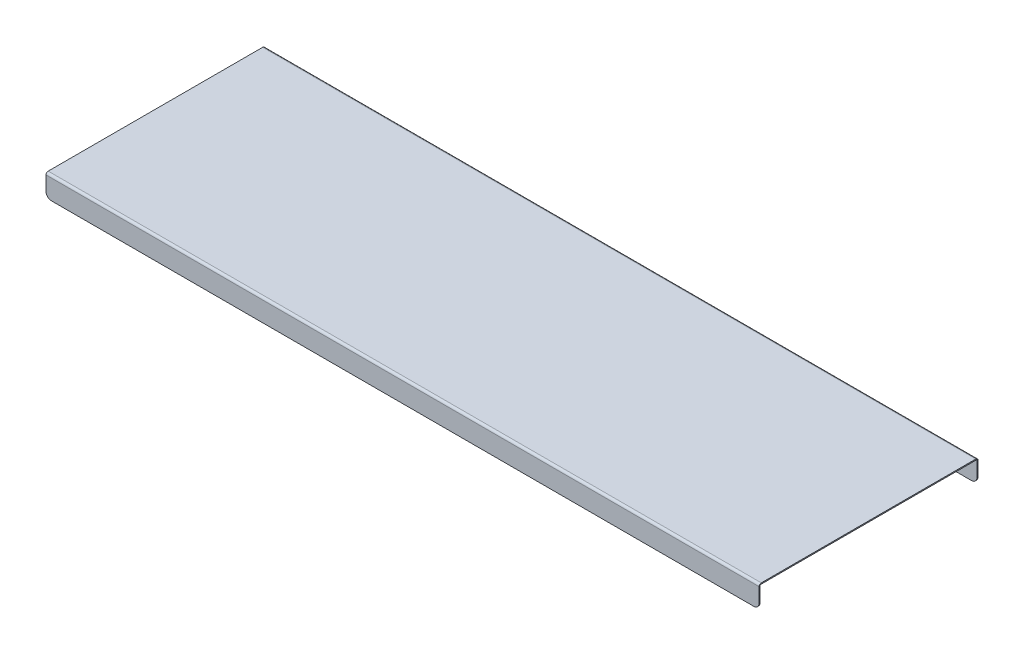
ISO-10303-21;
HEADER;
FILE_DESCRIPTION(('STEP AP214'),'2;1');
FILE_NAME('part.step','',(''),(''),'','','');
FILE_SCHEMA(('AUTOMOTIVE_DESIGN { 1 0 10303 214 1 1 1 1 }'));
ENDSEC;
DATA;
#1=APPLICATION_CONTEXT('core data for automotive mechanical design processes');
#2=APPLICATION_PROTOCOL_DEFINITION('international standard','automotive_design',2000,#1);
#3=PRODUCT_CONTEXT('',#1,'mechanical');
#4=PRODUCT('Part','Part','',(#3));
#5=PRODUCT_RELATED_PRODUCT_CATEGORY('part','',(#4));
#6=PRODUCT_DEFINITION_FORMATION('','',#4);
#7=PRODUCT_DEFINITION_CONTEXT('part definition',#1,'design');
#8=PRODUCT_DEFINITION('design','',#6,#7);
#9=PRODUCT_DEFINITION_SHAPE('','',#8);
#10=(LENGTH_UNIT() NAMED_UNIT(*) SI_UNIT(.MILLI.,.METRE.));
#11=(NAMED_UNIT(*) PLANE_ANGLE_UNIT() SI_UNIT($,.RADIAN.));
#12=(NAMED_UNIT(*) SI_UNIT($,.STERADIAN.) SOLID_ANGLE_UNIT());
#13=UNCERTAINTY_MEASURE_WITH_UNIT(LENGTH_MEASURE(1.E-05),#10,'distance_accuracy_value','');
#14=(GEOMETRIC_REPRESENTATION_CONTEXT(3) GLOBAL_UNCERTAINTY_ASSIGNED_CONTEXT((#13)) GLOBAL_UNIT_ASSIGNED_CONTEXT((#10,
#11,#12)) REPRESENTATION_CONTEXT('',''));
#15=CARTESIAN_POINT('',(0.,0.,0.));
#16=DIRECTION('',(0.,0.,1.));
#17=DIRECTION('',(1.,0.,0.));
#18=AXIS2_PLACEMENT_3D('',#15,#16,#17);
#19=CARTESIAN_POINT('',(650.,-40.,197.5));
#20=DIRECTION('',(0.,-1.,0.));
#21=DIRECTION('',(0.,0.,-1.));
#22=AXIS2_PLACEMENT_3D('',#19,#20,#21);
#23=PLANE('',#22);
#24=DIRECTION('',(-1.,0.,0.));
#25=VECTOR('',#24,1.);
#26=CARTESIAN_POINT('',(650.,-40.,197.5));
#27=LINE('',#26,#25);
#28=CARTESIAN_POINT('',(640.,-40.,197.5));
#29=VERTEX_POINT('',#28);
#30=CARTESIAN_POINT('',(-640.,-40.,197.5));
#31=VERTEX_POINT('',#30);
#32=EDGE_CURVE('E190',#29,#31,#27,.T.);
#33=ORIENTED_EDGE('',*,*,#32,.F.);
#34=DIRECTION('',(0.,0.,-1.));
#35=VECTOR('',#34,1.);
#36=CARTESIAN_POINT('',(640.,-40.,719.6364));
#37=LINE('',#36,#35);
#38=CARTESIAN_POINT('',(640.,-40.,199.5));
#39=VERTEX_POINT('',#38);
#40=EDGE_CURVE('E166',#39,#29,#37,.T.);
#41=ORIENTED_EDGE('',*,*,#40,.F.);
#42=DIRECTION('',(1.,0.,0.));
#43=VECTOR('',#42,1.);
#44=CARTESIAN_POINT('',(650.,-40.,199.5));
#45=LINE('',#44,#43);
#46=CARTESIAN_POINT('',(-640.,-40.,199.5));
#47=VERTEX_POINT('',#46);
#48=EDGE_CURVE('E199',#47,#39,#45,.T.);
#49=ORIENTED_EDGE('',*,*,#48,.F.);
#50=DIRECTION('',(0.,0.,1.));
#51=VECTOR('',#50,1.);
#52=CARTESIAN_POINT('',(-640.,-40.,-719.6364));
#53=LINE('',#52,#51);
#54=EDGE_CURVE('E126',#31,#47,#53,.T.);
#55=ORIENTED_EDGE('',*,*,#54,.F.);
#56=EDGE_LOOP('',(#33,#41,#49,#55));
#57=FACE_BOUND('',#56,.T.);
#58=ADVANCED_FACE('F17',(#57),#23,.T.);
#59=CARTESIAN_POINT('',(-640.,-30.,-719.6364));
#60=DIRECTION('',(0.,0.,1.));
#61=DIRECTION('',(1.,0.,0.));
#62=AXIS2_PLACEMENT_3D('',#59,#60,#61);
#63=CYLINDRICAL_SURFACE('',#62,10.);
#64=ORIENTED_EDGE('',*,*,#54,.T.);
#65=CARTESIAN_POINT('',(-640.,-30.,199.5));
#66=DIRECTION('',(0.,0.,1.));
#67=DIRECTION('',(1.,0.,0.));
#68=AXIS2_PLACEMENT_3D('',#65,#66,#67);
#69=CIRCLE('',#68,10.);
#70=CARTESIAN_POINT('',(-650.,-30.,199.5));
#71=VERTEX_POINT('',#70);
#72=EDGE_CURVE('E168',#71,#47,#69,.T.);
#73=ORIENTED_EDGE('',*,*,#72,.F.);
#74=DIRECTION('',(0.,0.,1.));
#75=VECTOR('',#74,1.);
#76=CARTESIAN_POINT('',(-650.,-30.,0.));
#77=LINE('',#76,#75);
#78=CARTESIAN_POINT('',(-650.,-30.,197.5));
#79=VERTEX_POINT('',#78);
#80=EDGE_CURVE('E157',#79,#71,#77,.T.);
#81=ORIENTED_EDGE('',*,*,#80,.F.);
#82=CARTESIAN_POINT('',(-640.,-30.,197.5));
#83=DIRECTION('',(0.,0.,1.));
#84=DIRECTION('',(1.,0.,0.));
#85=AXIS2_PLACEMENT_3D('',#82,#83,#84);
#86=CIRCLE('',#85,10.);
#87=EDGE_CURVE('E188',#31,#79,#86,.F.);
#88=ORIENTED_EDGE('',*,*,#87,.F.);
#89=EDGE_LOOP('',(#64,#73,#81,#88));
#90=FACE_BOUND('',#89,.T.);
#91=ADVANCED_FACE('F391',(#90),#63,.T.);
#92=CARTESIAN_POINT('',(-640.,-30.,-719.6364));
#93=DIRECTION('',(0.,0.,1.));
#94=DIRECTION('',(1.,0.,0.));
#95=AXIS2_PLACEMENT_3D('',#92,#93,#94);
#96=CYLINDRICAL_SURFACE('',#95,10.);
#97=DIRECTION('',(0.,0.,-1.));
#98=VECTOR('',#97,1.);
#99=CARTESIAN_POINT('',(-640.,-40.,-199.5));
#100=LINE('',#99,#98);
#101=CARTESIAN_POINT('',(-640.,-40.,-197.5));
#102=VERTEX_POINT('',#101);
#103=CARTESIAN_POINT('',(-640.,-40.,-199.5));
#104=VERTEX_POINT('',#103);
#105=EDGE_CURVE('E114',#102,#104,#100,.T.);
#106=ORIENTED_EDGE('',*,*,#105,.F.);
#107=CARTESIAN_POINT('',(-640.,-30.,-197.5));
#108=DIRECTION('',(0.,0.,1.));
#109=DIRECTION('',(1.,0.,0.));
#110=AXIS2_PLACEMENT_3D('',#107,#108,#109);
#111=CIRCLE('',#110,10.);
#112=CARTESIAN_POINT('',(-650.,-30.,-197.5));
#113=VERTEX_POINT('',#112);
#114=EDGE_CURVE('E178',#113,#102,#111,.T.);
#115=ORIENTED_EDGE('',*,*,#114,.F.);
#116=DIRECTION('',(0.,0.,1.));
#117=VECTOR('',#116,1.);
#118=CARTESIAN_POINT('',(-650.,-30.,0.));
#119=LINE('',#118,#117);
#120=CARTESIAN_POINT('',(-650.,-30.,-199.5));
#121=VERTEX_POINT('',#120);
#122=EDGE_CURVE('E131',#121,#113,#119,.T.);
#123=ORIENTED_EDGE('',*,*,#122,.F.);
#124=CARTESIAN_POINT('',(-640.,-30.,-199.5));
#125=DIRECTION('',(0.,0.,1.));
#126=DIRECTION('',(1.,0.,0.));
#127=AXIS2_PLACEMENT_3D('',#124,#125,#126);
#128=CIRCLE('',#127,10.);
#129=EDGE_CURVE('E20',#104,#121,#128,.F.);
#130=ORIENTED_EDGE('',*,*,#129,.F.);
#131=EDGE_LOOP('',(#106,#115,#123,#130));
#132=FACE_BOUND('',#131,.T.);
#133=ADVANCED_FACE('F130',(#132),#96,.T.);
#134=CARTESIAN_POINT('',(650.,-40.,-199.5));
#135=DIRECTION('',(0.,-1.,0.));
#136=DIRECTION('',(0.,0.,-1.));
#137=AXIS2_PLACEMENT_3D('',#134,#135,#136);
#138=PLANE('',#137);
#139=DIRECTION('',(-1.,0.,0.));
#140=VECTOR('',#139,1.);
#141=CARTESIAN_POINT('',(650.,-40.,-199.5));
#142=LINE('',#141,#140);
#143=CARTESIAN_POINT('',(640.,-40.,-199.5));
#144=VERTEX_POINT('',#143);
#145=EDGE_CURVE('E118',#144,#104,#142,.T.);
#146=ORIENTED_EDGE('',*,*,#145,.F.);
#147=DIRECTION('',(0.,0.,-1.));
#148=VECTOR('',#147,1.);
#149=CARTESIAN_POINT('',(640.,-40.,719.6364));
#150=LINE('',#149,#148);
#151=CARTESIAN_POINT('',(640.,-40.,-197.5));
#152=VERTEX_POINT('',#151);
#153=EDGE_CURVE('E135',#152,#144,#150,.T.);
#154=ORIENTED_EDGE('',*,*,#153,.F.);
#155=DIRECTION('',(1.,0.,0.));
#156=VECTOR('',#155,1.);
#157=CARTESIAN_POINT('',(650.,-40.,-197.5));
#158=LINE('',#157,#156);
#159=EDGE_CURVE('E121',#102,#152,#158,.T.);
#160=ORIENTED_EDGE('',*,*,#159,.F.);
#161=ORIENTED_EDGE('',*,*,#105,.T.);
#162=EDGE_LOOP('',(#146,#154,#160,#161));
#163=FACE_BOUND('',#162,.T.);
#164=ADVANCED_FACE('F116',(#163),#138,.T.);
#165=CARTESIAN_POINT('',(-2344.68,-4.,-195.5));
#166=DIRECTION('',(1.,0.,0.));
#167=DIRECTION('',(0.,0.,-1.));
#168=AXIS2_PLACEMENT_3D('',#165,#166,#167);
#169=CYLINDRICAL_SURFACE('',#168,4.);
#170=DIRECTION('',(1.,0.,0.));
#171=VECTOR('',#170,1.);
#172=CARTESIAN_POINT('',(650.,0.,-195.5));
#173=LINE('',#172,#171);
#174=CARTESIAN_POINT('',(650.,0.,-195.5));
#175=VERTEX_POINT('',#174);
#176=CARTESIAN_POINT('',(-650.,0.,-195.5));
#177=VERTEX_POINT('',#176);
#178=EDGE_CURVE('E241',#175,#177,#173,.F.);
#179=ORIENTED_EDGE('',*,*,#178,.F.);
#180=CARTESIAN_POINT('',(650.,-4.,-195.5));
#181=DIRECTION('',(1.,0.,0.));
#182=DIRECTION('',(0.,0.,-1.));
#183=AXIS2_PLACEMENT_3D('',#180,#181,#182);
#184=CIRCLE('',#183,4.);
#185=CARTESIAN_POINT('',(650.,-4.,-199.5));
#186=VERTEX_POINT('',#185);
#187=EDGE_CURVE('E173',#175,#186,#184,.F.);
#188=ORIENTED_EDGE('',*,*,#187,.T.);
#189=DIRECTION('',(-1.,0.,0.));
#190=VECTOR('',#189,1.);
#191=CARTESIAN_POINT('',(650.,-4.,-199.5));
#192=LINE('',#191,#190);
#193=CARTESIAN_POINT('',(-650.,-4.,-199.5));
#194=VERTEX_POINT('',#193);
#195=EDGE_CURVE('E125',#194,#186,#192,.F.);
#196=ORIENTED_EDGE('',*,*,#195,.F.);
#197=CARTESIAN_POINT('',(-650.,-4.,-195.5));
#198=DIRECTION('',(1.,0.,0.));
#199=DIRECTION('',(0.,0.,-1.));
#200=AXIS2_PLACEMENT_3D('',#197,#198,#199);
#201=CIRCLE('',#200,4.);
#202=EDGE_CURVE('E184',#177,#194,#201,.F.);
#203=ORIENTED_EDGE('',*,*,#202,.F.);
#204=EDGE_LOOP('',(#179,#188,#196,#203));
#205=FACE_BOUND('',#204,.T.);
#206=ADVANCED_FACE('F271',(#205),#169,.T.);
#207=CARTESIAN_POINT('',(650.,0.,-199.5));
#208=DIRECTION('',(0.,0.,-1.));
#209=DIRECTION('',(-1.,0.,0.));
#210=AXIS2_PLACEMENT_3D('',#207,#208,#209);
#211=PLANE('',#210);
#212=ORIENTED_EDGE('',*,*,#145,.T.);
#213=ORIENTED_EDGE('',*,*,#129,.T.);
#214=DIRECTION('',(0.,1.,0.));
#215=VECTOR('',#214,1.);
#216=CARTESIAN_POINT('',(-650.,0.,-199.5));
#217=LINE('',#216,#215);
#218=EDGE_CURVE('E150',#194,#121,#217,.F.);
#219=ORIENTED_EDGE('',*,*,#218,.F.);
#220=ORIENTED_EDGE('',*,*,#195,.T.);
#221=DIRECTION('',(0.,1.,0.));
#222=VECTOR('',#221,1.);
#223=CARTESIAN_POINT('',(650.,0.,-199.5));
#224=LINE('',#223,#222);
#225=CARTESIAN_POINT('',(650.,-30.,-199.5));
#226=VERTEX_POINT('',#225);
#227=EDGE_CURVE('E175',#186,#226,#224,.F.);
#228=ORIENTED_EDGE('',*,*,#227,.T.);
#229=CARTESIAN_POINT('',(640.,-30.,-199.5));
#230=DIRECTION('',(0.,0.,-1.));
#231=DIRECTION('',(-1.,0.,0.));
#232=AXIS2_PLACEMENT_3D('',#229,#230,#231);
#233=CIRCLE('',#232,10.);
#234=EDGE_CURVE('E138',#144,#226,#233,.F.);
#235=ORIENTED_EDGE('',*,*,#234,.F.);
#236=EDGE_LOOP('',(#212,#213,#219,#220,#228,#235));
#237=FACE_BOUND('',#236,.T.);
#238=ADVANCED_FACE('F136',(#237),#211,.T.);
#239=CARTESIAN_POINT('',(640.,-30.,719.6364));
#240=DIRECTION('',(0.,0.,-1.));
#241=DIRECTION('',(-1.,0.,0.));
#242=AXIS2_PLACEMENT_3D('',#239,#240,#241);
#243=CYLINDRICAL_SURFACE('',#242,10.);
#244=ORIENTED_EDGE('',*,*,#153,.T.);
#245=ORIENTED_EDGE('',*,*,#234,.T.);
#246=DIRECTION('',(0.,0.,1.));
#247=VECTOR('',#246,1.);
#248=CARTESIAN_POINT('',(650.,-30.,0.));
#249=LINE('',#248,#247);
#250=CARTESIAN_POINT('',(650.,-30.,-197.5));
#251=VERTEX_POINT('',#250);
#252=EDGE_CURVE('E205',#226,#251,#249,.T.);
#253=ORIENTED_EDGE('',*,*,#252,.T.);
#254=CARTESIAN_POINT('',(640.,-30.,-197.5));
#255=DIRECTION('',(0.,0.,-1.));
#256=DIRECTION('',(-1.,0.,0.));
#257=AXIS2_PLACEMENT_3D('',#254,#255,#256);
#258=CIRCLE('',#257,10.);
#259=EDGE_CURVE('E176',#152,#251,#258,.F.);
#260=ORIENTED_EDGE('',*,*,#259,.F.);
#261=EDGE_LOOP('',(#244,#245,#253,#260));
#262=FACE_BOUND('',#261,.T.);
#263=ADVANCED_FACE('F203',(#262),#243,.T.);
#264=CARTESIAN_POINT('',(640.,-30.,719.6364));
#265=DIRECTION('',(0.,0.,-1.));
#266=DIRECTION('',(-1.,0.,0.));
#267=AXIS2_PLACEMENT_3D('',#264,#265,#266);
#268=CYLINDRICAL_SURFACE('',#267,10.);
#269=ORIENTED_EDGE('',*,*,#40,.T.);
#270=CARTESIAN_POINT('',(640.,-30.,197.5));
#271=DIRECTION('',(0.,0.,-1.));
#272=DIRECTION('',(-1.,0.,0.));
#273=AXIS2_PLACEMENT_3D('',#270,#271,#272);
#274=CIRCLE('',#273,10.);
#275=CARTESIAN_POINT('',(650.,-30.,197.5));
#276=VERTEX_POINT('',#275);
#277=EDGE_CURVE('E191',#276,#29,#274,.T.);
#278=ORIENTED_EDGE('',*,*,#277,.F.);
#279=DIRECTION('',(0.,0.,1.));
#280=VECTOR('',#279,1.);
#281=CARTESIAN_POINT('',(650.,-30.,0.));
#282=LINE('',#281,#280);
#283=CARTESIAN_POINT('',(650.,-30.,199.5));
#284=VERTEX_POINT('',#283);
#285=EDGE_CURVE('E247',#276,#284,#282,.T.);
#286=ORIENTED_EDGE('',*,*,#285,.T.);
#287=CARTESIAN_POINT('',(640.,-30.,199.5));
#288=DIRECTION('',(0.,0.,-1.));
#289=DIRECTION('',(-1.,0.,0.));
#290=AXIS2_PLACEMENT_3D('',#287,#288,#289);
#291=CIRCLE('',#290,10.);
#292=EDGE_CURVE('E195',#39,#284,#291,.F.);
#293=ORIENTED_EDGE('',*,*,#292,.F.);
#294=EDGE_LOOP('',(#269,#278,#286,#293));
#295=FACE_BOUND('',#294,.T.);
#296=ADVANCED_FACE('F347',(#295),#268,.T.);
#297=CARTESIAN_POINT('',(650.,-40.,199.5));
#298=DIRECTION('',(0.,0.,1.));
#299=DIRECTION('',(1.,0.,0.));
#300=AXIS2_PLACEMENT_3D('',#297,#298,#299);
#301=PLANE('',#300);
#302=DIRECTION('',(0.,1.,0.));
#303=VECTOR('',#302,1.);
#304=CARTESIAN_POINT('',(650.,0.,199.5));
#305=LINE('',#304,#303);
#306=CARTESIAN_POINT('',(650.,-4.,199.5));
#307=VERTEX_POINT('',#306);
#308=EDGE_CURVE('E172',#284,#307,#305,.T.);
#309=ORIENTED_EDGE('',*,*,#308,.T.);
#310=DIRECTION('',(1.,0.,0.));
#311=VECTOR('',#310,1.);
#312=CARTESIAN_POINT('',(-2344.68,-4.,199.5));
#313=LINE('',#312,#311);
#314=CARTESIAN_POINT('',(-650.,-4.,199.5));
#315=VERTEX_POINT('',#314);
#316=EDGE_CURVE('E198',#315,#307,#313,.T.);
#317=ORIENTED_EDGE('',*,*,#316,.F.);
#318=DIRECTION('',(0.,1.,0.));
#319=VECTOR('',#318,1.);
#320=CARTESIAN_POINT('',(-650.,0.,199.5));
#321=LINE('',#320,#319);
#322=EDGE_CURVE('E160',#71,#315,#321,.T.);
#323=ORIENTED_EDGE('',*,*,#322,.F.);
#324=ORIENTED_EDGE('',*,*,#72,.T.);
#325=ORIENTED_EDGE('',*,*,#48,.T.);
#326=ORIENTED_EDGE('',*,*,#292,.T.);
#327=EDGE_LOOP('',(#309,#317,#323,#324,#325,#326));
#328=FACE_BOUND('',#327,.T.);
#329=ADVANCED_FACE('F263',(#328),#301,.T.);
#330=CARTESIAN_POINT('',(-2344.68,-4.,195.5));
#331=DIRECTION('',(1.,0.,0.));
#332=DIRECTION('',(0.,0.,-1.));
#333=AXIS2_PLACEMENT_3D('',#330,#331,#332);
#334=CYLINDRICAL_SURFACE('',#333,4.);
#335=ORIENTED_EDGE('',*,*,#316,.T.);
#336=CARTESIAN_POINT('',(650.,-4.,195.5));
#337=DIRECTION('',(1.,0.,0.));
#338=DIRECTION('',(0.,0.,-1.));
#339=AXIS2_PLACEMENT_3D('',#336,#337,#338);
#340=CIRCLE('',#339,4.);
#341=CARTESIAN_POINT('',(650.,0.,195.5));
#342=VERTEX_POINT('',#341);
#343=EDGE_CURVE('E169',#307,#342,#340,.F.);
#344=ORIENTED_EDGE('',*,*,#343,.T.);
#345=DIRECTION('',(1.,0.,0.));
#346=VECTOR('',#345,1.);
#347=CARTESIAN_POINT('',(650.,0.,195.5));
#348=LINE('',#347,#346);
#349=CARTESIAN_POINT('',(-650.,0.,195.5));
#350=VERTEX_POINT('',#349);
#351=EDGE_CURVE('E194',#350,#342,#348,.T.);
#352=ORIENTED_EDGE('',*,*,#351,.F.);
#353=CARTESIAN_POINT('',(-650.,-4.,195.5));
#354=DIRECTION('',(1.,0.,0.));
#355=DIRECTION('',(0.,0.,-1.));
#356=AXIS2_PLACEMENT_3D('',#353,#354,#355);
#357=CIRCLE('',#356,4.);
#358=EDGE_CURVE('E181',#315,#350,#357,.F.);
#359=ORIENTED_EDGE('',*,*,#358,.F.);
#360=EDGE_LOOP('',(#335,#344,#352,#359));
#361=FACE_BOUND('',#360,.T.);
#362=ADVANCED_FACE('F269',(#361),#334,.T.);
#363=CARTESIAN_POINT('',(650.,0.,199.5));
#364=DIRECTION('',(0.,1.,0.));
#365=DIRECTION('',(0.,0.,1.));
#366=AXIS2_PLACEMENT_3D('',#363,#364,#365);
#367=PLANE('',#366);
#368=DIRECTION('',(0.,0.,1.));
#369=VECTOR('',#368,1.);
#370=CARTESIAN_POINT('',(-650.,0.,0.));
#371=LINE('',#370,#369);
#372=EDGE_CURVE('E187',#350,#177,#371,.F.);
#373=ORIENTED_EDGE('',*,*,#372,.F.);
#374=ORIENTED_EDGE('',*,*,#351,.T.);
#375=DIRECTION('',(0.,0.,1.));
#376=VECTOR('',#375,1.);
#377=CARTESIAN_POINT('',(650.,0.,0.));
#378=LINE('',#377,#376);
#379=EDGE_CURVE('E171',#342,#175,#378,.F.);
#380=ORIENTED_EDGE('',*,*,#379,.T.);
#381=ORIENTED_EDGE('',*,*,#178,.T.);
#382=EDGE_LOOP('',(#373,#374,#380,#381));
#383=FACE_BOUND('',#382,.T.);
#384=ADVANCED_FACE('F275',(#383),#367,.T.);
#385=CARTESIAN_POINT('',(650.,-2.,197.5));
#386=DIRECTION('',(0.,0.,-1.));
#387=DIRECTION('',(-1.,0.,0.));
#388=AXIS2_PLACEMENT_3D('',#385,#386,#387);
#389=PLANE('',#388);
#390=ORIENTED_EDGE('',*,*,#32,.T.);
#391=ORIENTED_EDGE('',*,*,#87,.T.);
#392=DIRECTION('',(0.,1.,0.));
#393=VECTOR('',#392,1.);
#394=CARTESIAN_POINT('',(-650.,0.,197.5));
#395=LINE('',#394,#393);
#396=CARTESIAN_POINT('',(-650.,-2.,197.5));
#397=VERTEX_POINT('',#396);
#398=EDGE_CURVE('E149',#397,#79,#395,.F.);
#399=ORIENTED_EDGE('',*,*,#398,.F.);
#400=DIRECTION('',(1.,0.,0.));
#401=VECTOR('',#400,1.);
#402=CARTESIAN_POINT('',(650.,-2.,197.5));
#403=LINE('',#402,#401);
#404=CARTESIAN_POINT('',(650.,-2.,197.5));
#405=VERTEX_POINT('',#404);
#406=EDGE_CURVE('E154',#405,#397,#403,.F.);
#407=ORIENTED_EDGE('',*,*,#406,.F.);
#408=DIRECTION('',(0.,1.,0.));
#409=VECTOR('',#408,1.);
#410=CARTESIAN_POINT('',(650.,0.,197.5));
#411=LINE('',#410,#409);
#412=EDGE_CURVE('E212',#405,#276,#411,.F.);
#413=ORIENTED_EDGE('',*,*,#412,.T.);
#414=ORIENTED_EDGE('',*,*,#277,.T.);
#415=EDGE_LOOP('',(#390,#391,#399,#407,#413,#414));
#416=FACE_BOUND('',#415,.T.);
#417=ADVANCED_FACE('F277',(#416),#389,.T.);
#418=CARTESIAN_POINT('',(-650.,0.,0.));
#419=DIRECTION('',(-1.,0.,0.));
#420=DIRECTION('',(0.,0.,1.));
#421=AXIS2_PLACEMENT_3D('',#418,#419,#420);
#422=PLANE('',#421);
#423=ORIENTED_EDGE('',*,*,#322,.T.);
#424=ORIENTED_EDGE('',*,*,#358,.T.);
#425=ORIENTED_EDGE('',*,*,#372,.T.);
#426=ORIENTED_EDGE('',*,*,#202,.T.);
#427=ORIENTED_EDGE('',*,*,#218,.T.);
#428=ORIENTED_EDGE('',*,*,#122,.T.);
#429=DIRECTION('',(0.,1.,0.));
#430=VECTOR('',#429,1.);
#431=CARTESIAN_POINT('',(-650.,-40.,-197.5));
#432=LINE('',#431,#430);
#433=CARTESIAN_POINT('',(-650.,-2.,-197.5));
#434=VERTEX_POINT('',#433);
#435=EDGE_CURVE('E180',#434,#113,#432,.F.);
#436=ORIENTED_EDGE('',*,*,#435,.F.);
#437=DIRECTION('',(0.,0.,-1.));
#438=VECTOR('',#437,1.);
#439=CARTESIAN_POINT('',(-650.,-2.,-197.5));
#440=LINE('',#439,#438);
#441=EDGE_CURVE('E151',#397,#434,#440,.T.);
#442=ORIENTED_EDGE('',*,*,#441,.F.);
#443=ORIENTED_EDGE('',*,*,#398,.T.);
#444=ORIENTED_EDGE('',*,*,#80,.T.);
#445=EDGE_LOOP('',(#423,#424,#425,#426,#427,#428,#436,#442,#443,#444));
#446=FACE_BOUND('',#445,.T.);
#447=ADVANCED_FACE('F273',(#446),#422,.T.);
#448=CARTESIAN_POINT('',(650.,-40.,-197.5));
#449=DIRECTION('',(0.,0.,1.));
#450=DIRECTION('',(1.,0.,0.));
#451=AXIS2_PLACEMENT_3D('',#448,#449,#450);
#452=PLANE('',#451);
#453=DIRECTION('',(0.,1.,0.));
#454=VECTOR('',#453,1.);
#455=CARTESIAN_POINT('',(650.,0.,-197.5));
#456=LINE('',#455,#454);
#457=CARTESIAN_POINT('',(650.,-2.,-197.5));
#458=VERTEX_POINT('',#457);
#459=EDGE_CURVE('E35',#251,#458,#456,.T.);
#460=ORIENTED_EDGE('',*,*,#459,.T.);
#461=DIRECTION('',(1.,0.,0.));
#462=VECTOR('',#461,1.);
#463=CARTESIAN_POINT('',(650.,-2.,-197.5));
#464=LINE('',#463,#462);
#465=EDGE_CURVE('E26',#434,#458,#464,.T.);
#466=ORIENTED_EDGE('',*,*,#465,.F.);
#467=ORIENTED_EDGE('',*,*,#435,.T.);
#468=ORIENTED_EDGE('',*,*,#114,.T.);
#469=ORIENTED_EDGE('',*,*,#159,.T.);
#470=ORIENTED_EDGE('',*,*,#259,.T.);
#471=EDGE_LOOP('',(#460,#466,#467,#468,#469,#470));
#472=FACE_BOUND('',#471,.T.);
#473=ADVANCED_FACE('F225',(#472),#452,.T.);
#474=CARTESIAN_POINT('',(650.,0.,0.));
#475=DIRECTION('',(-1.,0.,0.));
#476=DIRECTION('',(0.,0.,1.));
#477=AXIS2_PLACEMENT_3D('',#474,#475,#476);
#478=PLANE('',#477);
#479=ORIENTED_EDGE('',*,*,#343,.F.);
#480=ORIENTED_EDGE('',*,*,#308,.F.);
#481=ORIENTED_EDGE('',*,*,#285,.F.);
#482=ORIENTED_EDGE('',*,*,#412,.F.);
#483=DIRECTION('',(0.,0.,-1.));
#484=VECTOR('',#483,1.);
#485=CARTESIAN_POINT('',(650.,-2.,-197.5));
#486=LINE('',#485,#484);
#487=EDGE_CURVE('E11',#458,#405,#486,.F.);
#488=ORIENTED_EDGE('',*,*,#487,.F.);
#489=ORIENTED_EDGE('',*,*,#459,.F.);
#490=ORIENTED_EDGE('',*,*,#252,.F.);
#491=ORIENTED_EDGE('',*,*,#227,.F.);
#492=ORIENTED_EDGE('',*,*,#187,.F.);
#493=ORIENTED_EDGE('',*,*,#379,.F.);
#494=EDGE_LOOP('',(#479,#480,#481,#482,#488,#489,#490,#491,#492,#493));
#495=FACE_BOUND('',#494,.T.);
#496=ADVANCED_FACE('F209',(#495),#478,.F.);
#497=CARTESIAN_POINT('',(650.,-2.,-197.5));
#498=DIRECTION('',(0.,-1.,0.));
#499=DIRECTION('',(0.,0.,-1.));
#500=AXIS2_PLACEMENT_3D('',#497,#498,#499);
#501=PLANE('',#500);
#502=ORIENTED_EDGE('',*,*,#465,.T.);
#503=ORIENTED_EDGE('',*,*,#487,.T.);
#504=ORIENTED_EDGE('',*,*,#406,.T.);
#505=ORIENTED_EDGE('',*,*,#441,.T.);
#506=EDGE_LOOP('',(#502,#503,#504,#505));
#507=FACE_BOUND('',#506,.T.);
#508=ADVANCED_FACE('F221',(#507),#501,.T.);
#509=CLOSED_SHELL('',(#58,#91,#133,#164,#206,#238,#263,#296,#329,#362,#384,#417,#447,#473,#496,#508));
#510=MANIFOLD_SOLID_BREP('B1',#509);
#511=ADVANCED_BREP_SHAPE_REPRESENTATION('',(#18,#510),#14);
#512=SHAPE_DEFINITION_REPRESENTATION(#9,#511);
ENDSEC;
END-ISO-10303-21;
